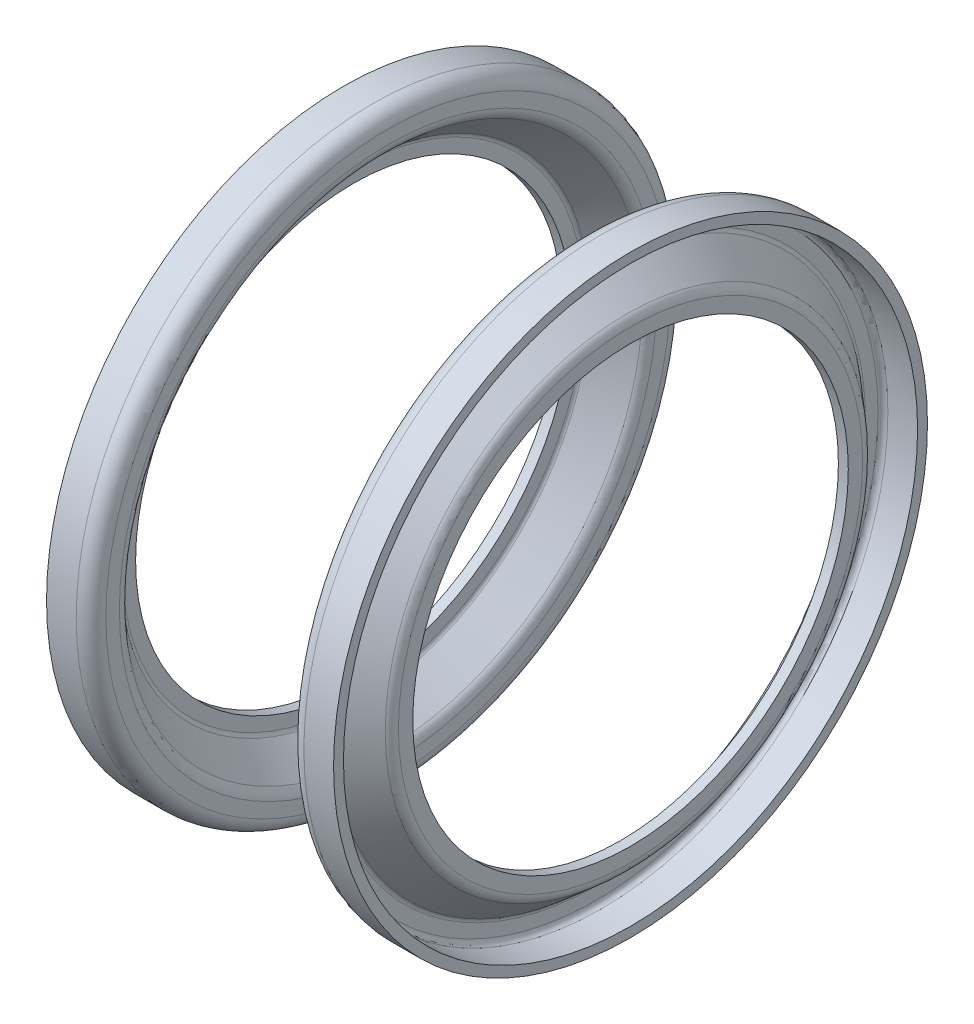
ISO-10303-21;
HEADER;
FILE_DESCRIPTION(('STEP AP214'),'2;1');
FILE_NAME('part.step','',(''),(''),'','','');
FILE_SCHEMA(('AUTOMOTIVE_DESIGN { 1 0 10303 214 1 1 1 1 }'));
ENDSEC;
DATA;
#1=APPLICATION_CONTEXT('core data for automotive mechanical design processes');
#2=APPLICATION_PROTOCOL_DEFINITION('international standard','automotive_design',2000,#1);
#3=PRODUCT_CONTEXT('',#1,'mechanical');
#4=PRODUCT('Part','Part','',(#3));
#5=PRODUCT_RELATED_PRODUCT_CATEGORY('part','',(#4));
#6=PRODUCT_DEFINITION_FORMATION('','',#4);
#7=PRODUCT_DEFINITION_CONTEXT('part definition',#1,'design');
#8=PRODUCT_DEFINITION('design','',#6,#7);
#9=PRODUCT_DEFINITION_SHAPE('','',#8);
#10=(LENGTH_UNIT() NAMED_UNIT(*) SI_UNIT(.MILLI.,.METRE.));
#11=(NAMED_UNIT(*) PLANE_ANGLE_UNIT() SI_UNIT($,.RADIAN.));
#12=(NAMED_UNIT(*) SI_UNIT($,.STERADIAN.) SOLID_ANGLE_UNIT());
#13=UNCERTAINTY_MEASURE_WITH_UNIT(LENGTH_MEASURE(1.E-05),#10,'distance_accuracy_value','');
#14=(GEOMETRIC_REPRESENTATION_CONTEXT(3) GLOBAL_UNCERTAINTY_ASSIGNED_CONTEXT((#13)) GLOBAL_UNIT_ASSIGNED_CONTEXT((#10,
#11,#12)) REPRESENTATION_CONTEXT('',''));
#15=CARTESIAN_POINT('',(0.,0.,0.));
#16=DIRECTION('',(0.,0.,1.));
#17=DIRECTION('',(1.,0.,0.));
#18=AXIS2_PLACEMENT_3D('',#15,#16,#17);
#19=CARTESIAN_POINT('',(-0.45,-3.01,-3.01));
#20=DIRECTION('',(-1.,0.,0.));
#21=DIRECTION('',(0.,0.,1.));
#22=AXIS2_PLACEMENT_3D('',#19,#20,#21);
#23=PLANE('',#22);
#24=CARTESIAN_POINT('',(-0.45,0.,0.));
#25=DIRECTION('',(-1.,0.,0.));
#26=DIRECTION('',(0.,0.,1.));
#27=AXIS2_PLACEMENT_3D('',#24,#25,#26);
#28=CIRCLE('',#27,2.9);
#29=CARTESIAN_POINT('',(-0.45,0.,2.9));
#30=VERTEX_POINT('',#29);
#31=CARTESIAN_POINT('',(-0.45,0.,-2.9));
#32=VERTEX_POINT('',#31);
#33=EDGE_CURVE('P0_E21',#30,#32,#28,.T.);
#34=ORIENTED_EDGE('',*,*,#33,.F.);
#35=CARTESIAN_POINT('',(-0.45,0.,0.));
#36=DIRECTION('',(-1.,0.,0.));
#37=DIRECTION('',(0.,0.,-1.));
#38=AXIS2_PLACEMENT_3D('',#35,#36,#37);
#39=CIRCLE('',#38,2.9);
#40=EDGE_CURVE('P0_E240',#32,#30,#39,.T.);
#41=ORIENTED_EDGE('',*,*,#40,.F.);
#42=EDGE_LOOP('',(#34,#41));
#43=FACE_BOUND('',#42,.T.);
#44=CARTESIAN_POINT('',(-0.45,0.,0.));
#45=DIRECTION('',(-1.,0.,0.));
#46=DIRECTION('',(0.,0.,1.));
#47=AXIS2_PLACEMENT_3D('',#44,#45,#46);
#48=CIRCLE('',#47,3.);
#49=CARTESIAN_POINT('',(-0.45,0.,3.));
#50=VERTEX_POINT('',#49);
#51=CARTESIAN_POINT('',(-0.45,0.,-3.));
#52=VERTEX_POINT('',#51);
#53=EDGE_CURVE('P0_E540',#50,#52,#48,.T.);
#54=ORIENTED_EDGE('',*,*,#53,.T.);
#55=CARTESIAN_POINT('',(-0.45,0.,0.));
#56=DIRECTION('',(-1.,0.,0.));
#57=DIRECTION('',(0.,0.,-1.));
#58=AXIS2_PLACEMENT_3D('',#55,#56,#57);
#59=CIRCLE('',#58,3.);
#60=EDGE_CURVE('P0_E27',#52,#50,#59,.T.);
#61=ORIENTED_EDGE('',*,*,#60,.T.);
#62=EDGE_LOOP('',(#54,#61));
#63=FACE_BOUND('',#62,.T.);
#64=ADVANCED_FACE('P0_F17',(#43,#63),#23,.T.);
#65=CARTESIAN_POINT('',(-0.45,0.,0.));
#66=DIRECTION('',(1.,0.,0.));
#67=DIRECTION('',(0.,0.,-1.));
#68=AXIS2_PLACEMENT_3D('',#65,#66,#67);
#69=CYLINDRICAL_SURFACE('',#68,3.);
#70=ORIENTED_EDGE('',*,*,#53,.F.);
#71=ORIENTED_EDGE('',*,*,#60,.F.);
#72=DIRECTION('',(1.,0.,0.));
#73=VECTOR('',#72,1.);
#74=CARTESIAN_POINT('',(-0.3,0.,-3.));
#75=LINE('',#74,#73);
#76=CARTESIAN_POINT('',(-0.15,0.,-3.));
#77=VERTEX_POINT('',#76);
#78=EDGE_CURVE('P0_E11',#52,#77,#75,.T.);
#79=ORIENTED_EDGE('',*,*,#78,.T.);
#80=CARTESIAN_POINT('',(-0.15,0.,0.));
#81=DIRECTION('',(-1.,0.,0.));
#82=DIRECTION('',(0.,0.,-1.));
#83=AXIS2_PLACEMENT_3D('',#80,#81,#82);
#84=CIRCLE('',#83,3.);
#85=CARTESIAN_POINT('',(-0.15,0.,3.));
#86=VERTEX_POINT('',#85);
#87=EDGE_CURVE('P0_E106',#77,#86,#84,.T.);
#88=ORIENTED_EDGE('',*,*,#87,.T.);
#89=CARTESIAN_POINT('',(-0.15,0.,0.));
#90=DIRECTION('',(-1.,0.,0.));
#91=DIRECTION('',(0.,0.,1.));
#92=AXIS2_PLACEMENT_3D('',#89,#90,#91);
#93=CIRCLE('',#92,3.);
#94=EDGE_CURVE('P0_E109',#86,#77,#93,.T.);
#95=ORIENTED_EDGE('',*,*,#94,.T.);
#96=ORIENTED_EDGE('',*,*,#78,.F.);
#97=EDGE_LOOP('',(#70,#71,#79,#88,#95,#96));
#98=FACE_BOUND('',#97,.T.);
#99=ADVANCED_FACE('P0_F108',(#98),#69,.T.);
#100=CARTESIAN_POINT('',(-0.150000000000003,0.,0.));
#101=DIRECTION('',(-1.,0.,0.));
#102=DIRECTION('',(0.,0.,1.));
#103=AXIS2_PLACEMENT_3D('',#100,#101,#102);
#104=TOROIDAL_SURFACE('',#103,2.85,0.150000000000001);
#105=ORIENTED_EDGE('',*,*,#94,.F.);
#106=ORIENTED_EDGE('',*,*,#87,.F.);
#107=CARTESIAN_POINT('',(-0.150000000000003,0.,-2.85));
#108=DIRECTION('',(0.,-1.,0.));
#109=DIRECTION('',(0.,0.,-1.));
#110=AXIS2_PLACEMENT_3D('',#107,#108,#109);
#111=CIRCLE('',#110,0.150000000000001);
#112=CARTESIAN_POINT('',(0.,0.,-2.85));
#113=VERTEX_POINT('',#112);
#114=EDGE_CURVE('P0_E113',#77,#113,#111,.T.);
#115=ORIENTED_EDGE('',*,*,#114,.T.);
#116=CARTESIAN_POINT('',(0.,0.,0.));
#117=DIRECTION('',(-1.,0.,0.));
#118=DIRECTION('',(0.,0.,-1.));
#119=AXIS2_PLACEMENT_3D('',#116,#117,#118);
#120=CIRCLE('',#119,2.85);
#121=CARTESIAN_POINT('',(0.,0.,2.85));
#122=VERTEX_POINT('',#121);
#123=EDGE_CURVE('P0_E118',#113,#122,#120,.T.);
#124=ORIENTED_EDGE('',*,*,#123,.T.);
#125=CARTESIAN_POINT('',(0.,0.,0.));
#126=DIRECTION('',(-1.,0.,0.));
#127=DIRECTION('',(0.,0.,1.));
#128=AXIS2_PLACEMENT_3D('',#125,#126,#127);
#129=CIRCLE('',#128,2.85);
#130=EDGE_CURVE('P0_E126',#122,#113,#129,.T.);
#131=ORIENTED_EDGE('',*,*,#130,.T.);
#132=ORIENTED_EDGE('',*,*,#114,.F.);
#133=EDGE_LOOP('',(#105,#106,#115,#124,#131,#132));
#134=FACE_BOUND('',#133,.T.);
#135=ADVANCED_FACE('P0_F115',(#134),#104,.T.);
#136=CARTESIAN_POINT('',(0.,-2.86,2.86));
#137=DIRECTION('',(1.,0.,0.));
#138=DIRECTION('',(0.,0.,-1.));
#139=AXIS2_PLACEMENT_3D('',#136,#137,#138);
#140=PLANE('',#139);
#141=CARTESIAN_POINT('',(0.,0.,0.));
#142=DIRECTION('',(-1.,0.,0.));
#143=DIRECTION('',(0.,0.,1.));
#144=AXIS2_PLACEMENT_3D('',#141,#142,#143);
#145=CIRCLE('',#144,2.71379804767391);
#146=CARTESIAN_POINT('',(0.,0.,2.71379804767391));
#147=VERTEX_POINT('',#146);
#148=CARTESIAN_POINT('',(0.,0.,-2.71379804767391));
#149=VERTEX_POINT('',#148);
#150=EDGE_CURVE('P0_E138',#147,#149,#145,.T.);
#151=ORIENTED_EDGE('',*,*,#150,.T.);
#152=CARTESIAN_POINT('',(0.,0.,0.));
#153=DIRECTION('',(-1.,0.,0.));
#154=DIRECTION('',(0.,0.,-1.));
#155=AXIS2_PLACEMENT_3D('',#152,#153,#154);
#156=CIRCLE('',#155,2.71379804767391);
#157=EDGE_CURVE('P0_E135',#149,#147,#156,.T.);
#158=ORIENTED_EDGE('',*,*,#157,.T.);
#159=EDGE_LOOP('',(#151,#158));
#160=FACE_BOUND('',#159,.T.);
#161=ORIENTED_EDGE('',*,*,#130,.F.);
#162=ORIENTED_EDGE('',*,*,#123,.F.);
#163=EDGE_LOOP('',(#161,#162));
#164=FACE_BOUND('',#163,.T.);
#165=ADVANCED_FACE('P0_F315',(#160,#164),#140,.T.);
#166=CARTESIAN_POINT('',(-0.129999999999563,0.,0.));
#167=DIRECTION('',(-1.,0.,0.));
#168=DIRECTION('',(0.,0.,1.));
#169=AXIS2_PLACEMENT_3D('',#166,#167,#168);
#170=TOROIDAL_SURFACE('',#169,2.71379804767391,0.129999999999562);
#171=ORIENTED_EDGE('',*,*,#150,.F.);
#172=ORIENTED_EDGE('',*,*,#157,.F.);
#173=CARTESIAN_POINT('',(-0.129999999999563,0.,-2.71379804767391));
#174=DIRECTION('',(0.,-1.,0.));
#175=DIRECTION('',(1.,0.,0.));
#176=AXIS2_PLACEMENT_3D('',#173,#174,#175);
#177=CIRCLE('',#176,0.129999999999562);
#178=CARTESIAN_POINT('',(-0.045397121450573,0.,-2.6150946893662));
#179=VERTEX_POINT('',#178);
#180=EDGE_CURVE('P0_E132',#149,#179,#177,.T.);
#181=ORIENTED_EDGE('',*,*,#180,.T.);
#182=CARTESIAN_POINT('',(-0.0453971214508456,0.,0.));
#183=DIRECTION('',(-1.,0.,0.));
#184=DIRECTION('',(0.,0.,-1.));
#185=AXIS2_PLACEMENT_3D('',#182,#183,#184);
#186=CIRCLE('',#185,2.61509468936652);
#187=CARTESIAN_POINT('',(-0.0453971214508456,0.,2.61509468936652));
#188=VERTEX_POINT('',#187);
#189=EDGE_CURVE('P0_E142',#179,#188,#186,.T.);
#190=ORIENTED_EDGE('',*,*,#189,.T.);
#191=CARTESIAN_POINT('',(-0.0453971214508456,0.,0.));
#192=DIRECTION('',(-1.,0.,0.));
#193=DIRECTION('',(0.,0.,1.));
#194=AXIS2_PLACEMENT_3D('',#191,#192,#193);
#195=CIRCLE('',#194,2.61509468936652);
#196=EDGE_CURVE('P0_E145',#188,#179,#195,.T.);
#197=ORIENTED_EDGE('',*,*,#196,.T.);
#198=ORIENTED_EDGE('',*,*,#180,.F.);
#199=EDGE_LOOP('',(#171,#172,#181,#190,#197,#198));
#200=FACE_BOUND('',#199,.T.);
#201=ADVANCED_FACE('P0_F318',(#200),#170,.T.);
#202=CARTESIAN_POINT('',(-0.045397121450573,0.,0.));
#203=DIRECTION('',(1.,0.,0.));
#204=DIRECTION('',(0.,0.,-1.));
#205=AXIS2_PLACEMENT_3D('',#202,#203,#204);
#206=CONICAL_SURFACE('',#205,2.6150946893662,0.708626272126568);
#207=CARTESIAN_POINT('',(-0.332539568672797,0.,0.));
#208=DIRECTION('',(-1.,0.,0.));
#209=DIRECTION('',(0.,0.,1.));
#210=AXIS2_PLACEMENT_3D('',#207,#208,#209);
#211=CIRCLE('',#210,2.3689725917477);
#212=CARTESIAN_POINT('',(-0.332539568672797,0.,2.3689725917477));
#213=VERTEX_POINT('',#212);
#214=CARTESIAN_POINT('',(-0.332539568672807,0.,-2.36897259174771));
#215=VERTEX_POINT('',#214);
#216=EDGE_CURVE('P0_E155',#213,#215,#211,.T.);
#217=ORIENTED_EDGE('',*,*,#216,.T.);
#218=DIRECTION('',(0.759256602366014,0.,-0.650791373455132));
#219=VECTOR('',#218,1.);
#220=CARTESIAN_POINT('',(-0.188968345061685,0.,-2.49203364055695));
#221=LINE('',#220,#219);
#222=EDGE_CURVE('P0_E149',#215,#179,#221,.T.);
#223=ORIENTED_EDGE('',*,*,#222,.T.);
#224=ORIENTED_EDGE('',*,*,#196,.F.);
#225=ORIENTED_EDGE('',*,*,#189,.F.);
#226=ORIENTED_EDGE('',*,*,#222,.F.);
#227=CARTESIAN_POINT('',(-0.332539568672797,0.,0.));
#228=DIRECTION('',(-1.,0.,0.));
#229=DIRECTION('',(0.,0.,-1.));
#230=AXIS2_PLACEMENT_3D('',#227,#228,#229);
#231=CIRCLE('',#230,2.3689725917477);
#232=EDGE_CURVE('P0_E153',#215,#213,#231,.T.);
#233=ORIENTED_EDGE('',*,*,#232,.T.);
#234=EDGE_LOOP('',(#217,#223,#224,#225,#226,#233));
#235=FACE_BOUND('',#234,.T.);
#236=ADVANCED_FACE('P0_F322',(#235),#206,.F.);
#237=CARTESIAN_POINT('',(-0.300000000000003,0.,0.));
#238=DIRECTION('',(-1.,0.,0.));
#239=DIRECTION('',(0.,0.,1.));
#240=AXIS2_PLACEMENT_3D('',#237,#238,#239);
#241=TOROIDAL_SURFACE('',#240,2.33100976162945,0.0499999999999984);
#242=CARTESIAN_POINT('',(-0.35,0.,0.));
#243=DIRECTION('',(-1.,0.,0.));
#244=DIRECTION('',(0.,0.,1.));
#245=AXIS2_PLACEMENT_3D('',#242,#243,#244);
#246=CIRCLE('',#245,2.33100976162943);
#247=CARTESIAN_POINT('',(-0.35,0.,2.33100976162943));
#248=VERTEX_POINT('',#247);
#249=CARTESIAN_POINT('',(-0.35,0.,-2.33100976162943));
#250=VERTEX_POINT('',#249);
#251=EDGE_CURVE('P0_E165',#248,#250,#246,.T.);
#252=ORIENTED_EDGE('',*,*,#251,.T.);
#253=CARTESIAN_POINT('',(-0.300000000000003,0.,-2.33100976162945));
#254=DIRECTION('',(0.,-1.,0.));
#255=DIRECTION('',(-1.,0.,3.90312782094806E-13));
#256=AXIS2_PLACEMENT_3D('',#253,#254,#255);
#257=CIRCLE('',#256,0.0499999999999984);
#258=EDGE_CURVE('P0_E158',#250,#215,#257,.T.);
#259=ORIENTED_EDGE('',*,*,#258,.T.);
#260=ORIENTED_EDGE('',*,*,#216,.F.);
#261=ORIENTED_EDGE('',*,*,#232,.F.);
#262=ORIENTED_EDGE('',*,*,#258,.F.);
#263=CARTESIAN_POINT('',(-0.35,0.,0.));
#264=DIRECTION('',(-1.,0.,0.));
#265=DIRECTION('',(0.,0.,-1.));
#266=AXIS2_PLACEMENT_3D('',#263,#264,#265);
#267=CIRCLE('',#266,2.33100976162943);
#268=EDGE_CURVE('P0_E162',#250,#248,#267,.T.);
#269=ORIENTED_EDGE('',*,*,#268,.T.);
#270=EDGE_LOOP('',(#252,#259,#260,#261,#262,#269));
#271=FACE_BOUND('',#270,.T.);
#272=ADVANCED_FACE('P0_F326',(#271),#241,.F.);
#273=CARTESIAN_POINT('',(-0.35,-2.34100976162943,2.34100976162943));
#274=DIRECTION('',(1.,0.,0.));
#275=DIRECTION('',(0.,0.,-1.));
#276=AXIS2_PLACEMENT_3D('',#273,#274,#275);
#277=PLANE('',#276);
#278=CARTESIAN_POINT('',(-0.35,0.,0.));
#279=DIRECTION('',(-1.,0.,0.));
#280=DIRECTION('',(0.,0.,1.));
#281=AXIS2_PLACEMENT_3D('',#278,#279,#280);
#282=CIRCLE('',#281,2.2);
#283=CARTESIAN_POINT('',(-0.35,0.,2.2));
#284=VERTEX_POINT('',#283);
#285=CARTESIAN_POINT('',(-0.35,0.,-2.2));
#286=VERTEX_POINT('',#285);
#287=EDGE_CURVE('P0_E172',#284,#286,#282,.T.);
#288=ORIENTED_EDGE('',*,*,#287,.T.);
#289=CARTESIAN_POINT('',(-0.35,0.,0.));
#290=DIRECTION('',(-1.,0.,0.));
#291=DIRECTION('',(0.,0.,-1.));
#292=AXIS2_PLACEMENT_3D('',#289,#290,#291);
#293=CIRCLE('',#292,2.2);
#294=EDGE_CURVE('P0_E169',#286,#284,#293,.T.);
#295=ORIENTED_EDGE('',*,*,#294,.T.);
#296=EDGE_LOOP('',(#288,#295));
#297=FACE_BOUND('',#296,.T.);
#298=ORIENTED_EDGE('',*,*,#251,.F.);
#299=ORIENTED_EDGE('',*,*,#268,.F.);
#300=EDGE_LOOP('',(#298,#299));
#301=FACE_BOUND('',#300,.T.);
#302=ADVANCED_FACE('P0_F330',(#297,#301),#277,.T.);
#303=CARTESIAN_POINT('',(-0.35,0.,0.));
#304=DIRECTION('',(-1.,0.,0.));
#305=DIRECTION('',(0.,0.,1.));
#306=AXIS2_PLACEMENT_3D('',#303,#304,#305);
#307=CYLINDRICAL_SURFACE('',#306,2.2);
#308=CARTESIAN_POINT('',(-0.45,0.,0.));
#309=DIRECTION('',(-1.,0.,0.));
#310=DIRECTION('',(0.,0.,1.));
#311=AXIS2_PLACEMENT_3D('',#308,#309,#310);
#312=CIRCLE('',#311,2.2);
#313=CARTESIAN_POINT('',(-0.45,0.,2.2));
#314=VERTEX_POINT('',#313);
#315=CARTESIAN_POINT('',(-0.45,0.,-2.2));
#316=VERTEX_POINT('',#315);
#317=EDGE_CURVE('P0_E183',#314,#316,#312,.T.);
#318=ORIENTED_EDGE('',*,*,#317,.T.);
#319=DIRECTION('',(1.,0.,0.));
#320=VECTOR('',#319,1.);
#321=CARTESIAN_POINT('',(-0.4,0.,-2.2));
#322=LINE('',#321,#320);
#323=EDGE_CURVE('P0_E176',#316,#286,#322,.T.);
#324=ORIENTED_EDGE('',*,*,#323,.T.);
#325=ORIENTED_EDGE('',*,*,#287,.F.);
#326=ORIENTED_EDGE('',*,*,#294,.F.);
#327=ORIENTED_EDGE('',*,*,#323,.F.);
#328=CARTESIAN_POINT('',(-0.45,0.,0.));
#329=DIRECTION('',(-1.,0.,0.));
#330=DIRECTION('',(0.,0.,-1.));
#331=AXIS2_PLACEMENT_3D('',#328,#329,#330);
#332=CIRCLE('',#331,2.2);
#333=EDGE_CURVE('P0_E180',#316,#314,#332,.T.);
#334=ORIENTED_EDGE('',*,*,#333,.T.);
#335=EDGE_LOOP('',(#318,#324,#325,#326,#327,#334));
#336=FACE_BOUND('',#335,.T.);
#337=ADVANCED_FACE('P0_F334',(#336),#307,.F.);
#338=CARTESIAN_POINT('',(-0.45,-2.35480780930355,-2.35480780930355));
#339=DIRECTION('',(-1.,0.,0.));
#340=DIRECTION('',(0.,0.,1.));
#341=AXIS2_PLACEMENT_3D('',#338,#339,#340);
#342=PLANE('',#341);
#343=ORIENTED_EDGE('',*,*,#317,.F.);
#344=ORIENTED_EDGE('',*,*,#333,.F.);
#345=EDGE_LOOP('',(#343,#344));
#346=FACE_BOUND('',#345,.T.);
#347=CARTESIAN_POINT('',(-0.45,0.,0.));
#348=DIRECTION('',(-1.,0.,0.));
#349=DIRECTION('',(0.,0.,1.));
#350=AXIS2_PLACEMENT_3D('',#347,#348,#349);
#351=CIRCLE('',#350,2.34480780930355);
#352=CARTESIAN_POINT('',(-0.45,0.,2.34480780930355));
#353=VERTEX_POINT('',#352);
#354=CARTESIAN_POINT('',(-0.45,0.,-2.34480780930355));
#355=VERTEX_POINT('',#354);
#356=EDGE_CURVE('P0_E194',#353,#355,#351,.T.);
#357=ORIENTED_EDGE('',*,*,#356,.T.);
#358=CARTESIAN_POINT('',(-0.45,0.,0.));
#359=DIRECTION('',(-1.,0.,0.));
#360=DIRECTION('',(0.,0.,-1.));
#361=AXIS2_PLACEMENT_3D('',#358,#359,#360);
#362=CIRCLE('',#361,2.34480780930355);
#363=EDGE_CURVE('P0_E190',#355,#353,#362,.T.);
#364=ORIENTED_EDGE('',*,*,#363,.T.);
#365=EDGE_LOOP('',(#357,#364));
#366=FACE_BOUND('',#365,.T.);
#367=ADVANCED_FACE('P0_F338',(#346,#366),#342,.T.);
#368=CARTESIAN_POINT('',(-0.329999999999996,0.,0.));
#369=DIRECTION('',(-1.,0.,0.));
#370=DIRECTION('',(0.,0.,1.));
#371=AXIS2_PLACEMENT_3D('',#368,#369,#370);
#372=TOROIDAL_SURFACE('',#371,2.34480780930357,0.120000000000003);
#373=ORIENTED_EDGE('',*,*,#356,.F.);
#374=ORIENTED_EDGE('',*,*,#363,.F.);
#375=CARTESIAN_POINT('',(-0.329999999999996,0.,-2.34480780930358));
#376=DIRECTION('',(0.,-1.,0.));
#377=DIRECTION('',(-1.,0.,2.16840434497094E-13));
#378=AXIS2_PLACEMENT_3D('',#375,#376,#377);
#379=CIRCLE('',#378,0.120000000000003);
#380=CARTESIAN_POINT('',(-0.408094964814718,0.,-2.43591860158738));
#381=VERTEX_POINT('',#380);
#382=EDGE_CURVE('P0_E187',#355,#381,#379,.T.);
#383=ORIENTED_EDGE('',*,*,#382,.T.);
#384=CARTESIAN_POINT('',(-0.40809496481473,0.,0.));
#385=DIRECTION('',(-1.,0.,0.));
#386=DIRECTION('',(0.,0.,-1.));
#387=AXIS2_PLACEMENT_3D('',#384,#385,#386);
#388=CIRCLE('',#387,2.4359186015874);
#389=CARTESIAN_POINT('',(-0.40809496481473,0.,2.4359186015874));
#390=VERTEX_POINT('',#389);
#391=EDGE_CURVE('P0_E201',#381,#390,#388,.T.);
#392=ORIENTED_EDGE('',*,*,#391,.T.);
#393=CARTESIAN_POINT('',(-0.40809496481473,0.,0.));
#394=DIRECTION('',(-1.,0.,0.));
#395=DIRECTION('',(0.,0.,1.));
#396=AXIS2_PLACEMENT_3D('',#393,#394,#395);
#397=CIRCLE('',#396,2.4359186015874);
#398=EDGE_CURVE('P0_E204',#390,#381,#397,.T.);
#399=ORIENTED_EDGE('',*,*,#398,.T.);
#400=ORIENTED_EDGE('',*,*,#382,.F.);
#401=EDGE_LOOP('',(#373,#374,#383,#392,#399,#400));
#402=FACE_BOUND('',#401,.T.);
#403=ADVANCED_FACE('P0_F342',(#402),#372,.T.);
#404=CARTESIAN_POINT('',(-0.408094964814718,0.,0.));
#405=DIRECTION('',(1.,0.,0.));
#406=DIRECTION('',(0.,0.,-1.));
#407=AXIS2_PLACEMENT_3D('',#404,#405,#406);
#408=CONICAL_SURFACE('',#407,2.43591860158738,0.708626272127681);
#409=ORIENTED_EDGE('',*,*,#398,.F.);
#410=ORIENTED_EDGE('',*,*,#391,.F.);
#411=DIRECTION('',(0.759256602365289,0.,-0.650791373455977));
#412=VECTOR('',#411,1.);
#413=CARTESIAN_POINT('',(-0.262777698070689,0.,-2.56047625879655));
#414=LINE('',#413,#412);
#415=CARTESIAN_POINT('',(-0.117460431325448,0.,-2.6850339160043));
#416=VERTEX_POINT('',#415);
#417=EDGE_CURVE('P0_E198',#381,#416,#414,.T.);
#418=ORIENTED_EDGE('',*,*,#417,.T.);
#419=CARTESIAN_POINT('',(-0.117460431325448,0.,0.));
#420=DIRECTION('',(-1.,0.,0.));
#421=DIRECTION('',(0.,0.,-1.));
#422=AXIS2_PLACEMENT_3D('',#419,#420,#421);
#423=CIRCLE('',#422,2.6850339160043);
#424=CARTESIAN_POINT('',(-0.117460431325448,0.,2.6850339160043));
#425=VERTEX_POINT('',#424);
#426=EDGE_CURVE('P0_E208',#416,#425,#423,.T.);
#427=ORIENTED_EDGE('',*,*,#426,.T.);
#428=CARTESIAN_POINT('',(-0.117460431325448,0.,0.));
#429=DIRECTION('',(-1.,0.,0.));
#430=DIRECTION('',(0.,0.,1.));
#431=AXIS2_PLACEMENT_3D('',#428,#429,#430);
#432=CIRCLE('',#431,2.6850339160043);
#433=EDGE_CURVE('P0_E212',#425,#416,#432,.T.);
#434=ORIENTED_EDGE('',*,*,#433,.T.);
#435=ORIENTED_EDGE('',*,*,#417,.F.);
#436=EDGE_LOOP('',(#409,#410,#418,#427,#434,#435));
#437=FACE_BOUND('',#436,.T.);
#438=ADVANCED_FACE('P0_F285',(#437),#408,.T.);
#439=CARTESIAN_POINT('',(-0.150000000002818,0.,0.));
#440=DIRECTION('',(-1.,0.,0.));
#441=DIRECTION('',(0.,0.,1.));
#442=AXIS2_PLACEMENT_3D('',#439,#440,#441);
#443=TOROIDAL_SURFACE('',#442,2.72299674612235,0.0500000000028179);
#444=CARTESIAN_POINT('',(-0.1,0.,0.));
#445=DIRECTION('',(-1.,0.,0.));
#446=DIRECTION('',(0.,0.,1.));
#447=AXIS2_PLACEMENT_3D('',#444,#445,#446);
#448=CIRCLE('',#447,2.72299674612891);
#449=CARTESIAN_POINT('',(-0.1,0.,2.72299674612891));
#450=VERTEX_POINT('',#449);
#451=CARTESIAN_POINT('',(-0.1,0.,-2.72299674612891));
#452=VERTEX_POINT('',#451);
#453=EDGE_CURVE('P0_E224',#450,#452,#448,.T.);
#454=ORIENTED_EDGE('',*,*,#453,.T.);
#455=CARTESIAN_POINT('',(-0.150000000002818,0.,-2.72299674612236));
#456=DIRECTION('',(0.,-1.,0.));
#457=DIRECTION('',(1.,0.,-1.31058358602661E-10));
#458=AXIS2_PLACEMENT_3D('',#455,#456,#457);
#459=CIRCLE('',#458,0.0500000000028179);
#460=EDGE_CURVE('P0_E216',#452,#416,#459,.T.);
#461=ORIENTED_EDGE('',*,*,#460,.T.);
#462=ORIENTED_EDGE('',*,*,#433,.F.);
#463=ORIENTED_EDGE('',*,*,#426,.F.);
#464=ORIENTED_EDGE('',*,*,#460,.F.);
#465=CARTESIAN_POINT('',(-0.1,0.,0.));
#466=DIRECTION('',(-1.,0.,0.));
#467=DIRECTION('',(0.,0.,-1.));
#468=AXIS2_PLACEMENT_3D('',#465,#466,#467);
#469=CIRCLE('',#468,2.72299674612891);
#470=EDGE_CURVE('P0_E220',#452,#450,#469,.T.);
#471=ORIENTED_EDGE('',*,*,#470,.T.);
#472=EDGE_LOOP('',(#454,#461,#462,#463,#464,#471));
#473=FACE_BOUND('',#472,.T.);
#474=ADVANCED_FACE('P0_F289',(#473),#443,.F.);
#475=CARTESIAN_POINT('',(-0.1,-2.86,-2.86));
#476=DIRECTION('',(-1.,0.,0.));
#477=DIRECTION('',(0.,0.,1.));
#478=AXIS2_PLACEMENT_3D('',#475,#476,#477);
#479=PLANE('',#478);
#480=ORIENTED_EDGE('',*,*,#453,.F.);
#481=ORIENTED_EDGE('',*,*,#470,.F.);
#482=EDGE_LOOP('',(#480,#481));
#483=FACE_BOUND('',#482,.T.);
#484=CARTESIAN_POINT('',(-0.1,0.,0.));
#485=DIRECTION('',(-1.,0.,0.));
#486=DIRECTION('',(0.,0.,1.));
#487=AXIS2_PLACEMENT_3D('',#484,#485,#486);
#488=CIRCLE('',#487,2.85);
#489=CARTESIAN_POINT('',(-0.1,0.,2.85));
#490=VERTEX_POINT('',#489);
#491=CARTESIAN_POINT('',(-0.1,0.,-2.85));
#492=VERTEX_POINT('',#491);
#493=EDGE_CURVE('P0_E232',#490,#492,#488,.T.);
#494=ORIENTED_EDGE('',*,*,#493,.T.);
#495=CARTESIAN_POINT('',(-0.1,0.,0.));
#496=DIRECTION('',(-1.,0.,0.));
#497=DIRECTION('',(0.,0.,-1.));
#498=AXIS2_PLACEMENT_3D('',#495,#496,#497);
#499=CIRCLE('',#498,2.85);
#500=EDGE_CURVE('P0_E228',#492,#490,#499,.T.);
#501=ORIENTED_EDGE('',*,*,#500,.T.);
#502=EDGE_LOOP('',(#494,#501));
#503=FACE_BOUND('',#502,.T.);
#504=ADVANCED_FACE('P0_F293',(#483,#503),#479,.T.);
#505=CARTESIAN_POINT('',(-0.150000000000003,0.,0.));
#506=DIRECTION('',(-1.,0.,0.));
#507=DIRECTION('',(0.,0.,1.));
#508=AXIS2_PLACEMENT_3D('',#505,#506,#507);
#509=TOROIDAL_SURFACE('',#508,2.85,0.0500000000000007);
#510=CARTESIAN_POINT('',(-0.15,0.,0.));
#511=DIRECTION('',(-1.,0.,0.));
#512=DIRECTION('',(0.,0.,1.));
#513=AXIS2_PLACEMENT_3D('',#510,#511,#512);
#514=CIRCLE('',#513,2.9);
#515=CARTESIAN_POINT('',(-0.15,0.,2.9));
#516=VERTEX_POINT('',#515);
#517=CARTESIAN_POINT('',(-0.15,0.,-2.9));
#518=VERTEX_POINT('',#517);
#519=EDGE_CURVE('P0_E248',#516,#518,#514,.T.);
#520=ORIENTED_EDGE('',*,*,#519,.T.);
#521=CARTESIAN_POINT('',(-0.150000000000003,0.,-2.85));
#522=DIRECTION('',(0.,-1.,0.));
#523=DIRECTION('',(0.,0.,-1.));
#524=AXIS2_PLACEMENT_3D('',#521,#522,#523);
#525=CIRCLE('',#524,0.0500000000000007);
#526=EDGE_CURVE('P0_E236',#518,#492,#525,.T.);
#527=ORIENTED_EDGE('',*,*,#526,.T.);
#528=ORIENTED_EDGE('',*,*,#493,.F.);
#529=ORIENTED_EDGE('',*,*,#500,.F.);
#530=ORIENTED_EDGE('',*,*,#526,.F.);
#531=CARTESIAN_POINT('',(-0.15,0.,0.));
#532=DIRECTION('',(-1.,0.,0.));
#533=DIRECTION('',(0.,0.,-1.));
#534=AXIS2_PLACEMENT_3D('',#531,#532,#533);
#535=CIRCLE('',#534,2.9);
#536=EDGE_CURVE('P0_E244',#518,#516,#535,.T.);
#537=ORIENTED_EDGE('',*,*,#536,.T.);
#538=EDGE_LOOP('',(#520,#527,#528,#529,#530,#537));
#539=FACE_BOUND('',#538,.T.);
#540=ADVANCED_FACE('P0_F296',(#539),#509,.F.);
#541=CARTESIAN_POINT('',(-0.15,0.,0.));
#542=DIRECTION('',(-1.,0.,0.));
#543=DIRECTION('',(0.,0.,1.));
#544=AXIS2_PLACEMENT_3D('',#541,#542,#543);
#545=CYLINDRICAL_SURFACE('',#544,2.9);
#546=ORIENTED_EDGE('',*,*,#33,.T.);
#547=DIRECTION('',(1.,0.,0.));
#548=VECTOR('',#547,1.);
#549=CARTESIAN_POINT('',(-0.3,0.,-2.9));
#550=LINE('',#549,#548);
#551=EDGE_CURVE('P0_E251',#32,#518,#550,.T.);
#552=ORIENTED_EDGE('',*,*,#551,.T.);
#553=ORIENTED_EDGE('',*,*,#519,.F.);
#554=ORIENTED_EDGE('',*,*,#536,.F.);
#555=ORIENTED_EDGE('',*,*,#551,.F.);
#556=ORIENTED_EDGE('',*,*,#40,.T.);
#557=EDGE_LOOP('',(#546,#552,#553,#554,#555,#556));
#558=FACE_BOUND('',#557,.T.);
#559=ADVANCED_FACE('P0_F19',(#558),#545,.F.);
#560=CLOSED_SHELL('',(#64,#99,#135,#165,#201,#236,#272,#302,#337,#367,#403,#438,#474,#504,#540,#559));
#561=MANIFOLD_SOLID_BREP('P0_B1',#560);
#562=CARTESIAN_POINT('',(2.12999999999957,0.,0.));
#563=DIRECTION('',(-1.,0.,0.));
#564=DIRECTION('',(0.,0.,1.));
#565=AXIS2_PLACEMENT_3D('',#562,#563,#564);
#566=TOROIDAL_SURFACE('',#565,2.7137980476739,0.129999999999572);
#567=CARTESIAN_POINT('',(2.04539712145057,0.,0.));
#568=DIRECTION('',(-1.,0.,0.));
#569=DIRECTION('',(0.,0.,1.));
#570=AXIS2_PLACEMENT_3D('',#567,#568,#569);
#571=CIRCLE('',#570,2.61509468936675);
#572=CARTESIAN_POINT('',(2.04539712145057,0.,2.61509468936675));
#573=VERTEX_POINT('',#572);
#574=CARTESIAN_POINT('',(2.04539712145057,0.,-2.61509468936675));
#575=VERTEX_POINT('',#574);
#576=EDGE_CURVE('P1_E21',#573,#575,#571,.T.);
#577=ORIENTED_EDGE('',*,*,#576,.F.);
#578=CARTESIAN_POINT('',(2.04539712145057,0.,0.));
#579=DIRECTION('',(-1.,0.,0.));
#580=DIRECTION('',(0.,0.,-1.));
#581=AXIS2_PLACEMENT_3D('',#578,#579,#580);
#582=CIRCLE('',#581,2.61509468936675);
#583=EDGE_CURVE('P1_E129',#575,#573,#582,.T.);
#584=ORIENTED_EDGE('',*,*,#583,.F.);
#585=CARTESIAN_POINT('',(2.12999999999957,0.,-2.71379804767391));
#586=DIRECTION('',(0.,-1.,0.));
#587=DIRECTION('',(-0.650791373456018,0.,0.759256602365254));
#588=AXIS2_PLACEMENT_3D('',#585,#586,#587);
#589=CIRCLE('',#588,0.129999999999572);
#590=CARTESIAN_POINT('',(2.,0.,-2.71379804767391));
#591=VERTEX_POINT('',#590);
#592=EDGE_CURVE('P1_E11',#575,#591,#589,.T.);
#593=ORIENTED_EDGE('',*,*,#592,.T.);
#594=CARTESIAN_POINT('',(2.,0.,0.));
#595=DIRECTION('',(-1.,0.,0.));
#596=DIRECTION('',(0.,0.,-1.));
#597=AXIS2_PLACEMENT_3D('',#594,#595,#596);
#598=CIRCLE('',#597,2.71379804767391);
#599=CARTESIAN_POINT('',(2.,0.,2.71379804767391));
#600=VERTEX_POINT('',#599);
#601=EDGE_CURVE('P1_E27',#591,#600,#598,.T.);
#602=ORIENTED_EDGE('',*,*,#601,.T.);
#603=CARTESIAN_POINT('',(2.,0.,0.));
#604=DIRECTION('',(-1.,0.,0.));
#605=DIRECTION('',(0.,0.,1.));
#606=AXIS2_PLACEMENT_3D('',#603,#604,#605);
#607=CIRCLE('',#606,2.71379804767391);
#608=EDGE_CURVE('P1_E275',#600,#591,#607,.T.);
#609=ORIENTED_EDGE('',*,*,#608,.T.);
#610=ORIENTED_EDGE('',*,*,#592,.F.);
#611=EDGE_LOOP('',(#577,#584,#593,#602,#609,#610));
#612=FACE_BOUND('',#611,.T.);
#613=ADVANCED_FACE('P1_F17',(#612),#566,.T.);
#614=CARTESIAN_POINT('',(2.,-2.86,-2.86));
#615=DIRECTION('',(-1.,0.,0.));
#616=DIRECTION('',(0.,0.,1.));
#617=AXIS2_PLACEMENT_3D('',#614,#615,#616);
#618=PLANE('',#617);
#619=ORIENTED_EDGE('',*,*,#608,.F.);
#620=ORIENTED_EDGE('',*,*,#601,.F.);
#621=EDGE_LOOP('',(#619,#620));
#622=FACE_BOUND('',#621,.T.);
#623=CARTESIAN_POINT('',(2.,0.,0.));
#624=DIRECTION('',(-1.,0.,0.));
#625=DIRECTION('',(0.,0.,1.));
#626=AXIS2_PLACEMENT_3D('',#623,#624,#625);
#627=CIRCLE('',#626,2.85);
#628=CARTESIAN_POINT('',(2.,0.,2.85));
#629=VERTEX_POINT('',#628);
#630=CARTESIAN_POINT('',(2.,0.,-2.85));
#631=VERTEX_POINT('',#630);
#632=EDGE_CURVE('P1_E265',#629,#631,#627,.T.);
#633=ORIENTED_EDGE('',*,*,#632,.T.);
#634=CARTESIAN_POINT('',(2.,0.,0.));
#635=DIRECTION('',(-1.,0.,0.));
#636=DIRECTION('',(0.,0.,-1.));
#637=AXIS2_PLACEMENT_3D('',#634,#635,#636);
#638=CIRCLE('',#637,2.85);
#639=EDGE_CURVE('P1_E269',#631,#629,#638,.T.);
#640=ORIENTED_EDGE('',*,*,#639,.T.);
#641=EDGE_LOOP('',(#633,#640));
#642=FACE_BOUND('',#641,.T.);
#643=ADVANCED_FACE('P1_F436',(#622,#642),#618,.T.);
#644=CARTESIAN_POINT('',(2.15,0.,0.));
#645=DIRECTION('',(-1.,0.,0.));
#646=DIRECTION('',(0.,0.,1.));
#647=AXIS2_PLACEMENT_3D('',#644,#645,#646);
#648=TOROIDAL_SURFACE('',#647,2.85,0.150000000000001);
#649=ORIENTED_EDGE('',*,*,#632,.F.);
#650=ORIENTED_EDGE('',*,*,#639,.F.);
#651=CARTESIAN_POINT('',(2.15,0.,-2.85));
#652=DIRECTION('',(0.,-1.,0.));
#653=DIRECTION('',(-1.,0.,0.));
#654=AXIS2_PLACEMENT_3D('',#651,#652,#653);
#655=CIRCLE('',#654,0.150000000000001);
#656=CARTESIAN_POINT('',(2.15,0.,-3.));
#657=VERTEX_POINT('',#656);
#658=EDGE_CURVE('P1_E272',#631,#657,#655,.T.);
#659=ORIENTED_EDGE('',*,*,#658,.T.);
#660=CARTESIAN_POINT('',(2.15,0.,0.));
#661=DIRECTION('',(-1.,0.,0.));
#662=DIRECTION('',(0.,0.,-1.));
#663=AXIS2_PLACEMENT_3D('',#660,#661,#662);
#664=CIRCLE('',#663,3.);
#665=CARTESIAN_POINT('',(2.15,0.,3.));
#666=VERTEX_POINT('',#665);
#667=EDGE_CURVE('P1_E259',#657,#666,#664,.T.);
#668=ORIENTED_EDGE('',*,*,#667,.T.);
#669=CARTESIAN_POINT('',(2.15,0.,0.));
#670=DIRECTION('',(-1.,0.,0.));
#671=DIRECTION('',(0.,0.,1.));
#672=AXIS2_PLACEMENT_3D('',#669,#670,#671);
#673=CIRCLE('',#672,3.);
#674=EDGE_CURVE('P1_E255',#666,#657,#673,.T.);
#675=ORIENTED_EDGE('',*,*,#674,.T.);
#676=ORIENTED_EDGE('',*,*,#658,.F.);
#677=EDGE_LOOP('',(#649,#650,#659,#668,#675,#676));
#678=FACE_BOUND('',#677,.T.);
#679=ADVANCED_FACE('P1_F447',(#678),#648,.T.);
#680=CARTESIAN_POINT('',(2.15,0.,0.));
#681=DIRECTION('',(1.,0.,0.));
#682=DIRECTION('',(0.,0.,-1.));
#683=AXIS2_PLACEMENT_3D('',#680,#681,#682);
#684=CYLINDRICAL_SURFACE('',#683,3.);
#685=ORIENTED_EDGE('',*,*,#674,.F.);
#686=ORIENTED_EDGE('',*,*,#667,.F.);
#687=DIRECTION('',(1.,0.,0.));
#688=VECTOR('',#687,1.);
#689=CARTESIAN_POINT('',(2.3,0.,-3.));
#690=LINE('',#689,#688);
#691=CARTESIAN_POINT('',(2.45,0.,-3.));
#692=VERTEX_POINT('',#691);
#693=EDGE_CURVE('P1_E262',#657,#692,#690,.T.);
#694=ORIENTED_EDGE('',*,*,#693,.T.);
#695=CARTESIAN_POINT('',(2.45,0.,0.));
#696=DIRECTION('',(-1.,0.,0.));
#697=DIRECTION('',(0.,0.,-1.));
#698=AXIS2_PLACEMENT_3D('',#695,#696,#697);
#699=CIRCLE('',#698,3.);
#700=CARTESIAN_POINT('',(2.45,0.,3.));
#701=VERTEX_POINT('',#700);
#702=EDGE_CURVE('P1_E252',#692,#701,#699,.T.);
#703=ORIENTED_EDGE('',*,*,#702,.T.);
#704=CARTESIAN_POINT('',(2.45,0.,0.));
#705=DIRECTION('',(-1.,0.,0.));
#706=DIRECTION('',(0.,0.,1.));
#707=AXIS2_PLACEMENT_3D('',#704,#705,#706);
#708=CIRCLE('',#707,3.);
#709=EDGE_CURVE('P1_E248',#701,#692,#708,.T.);
#710=ORIENTED_EDGE('',*,*,#709,.T.);
#711=ORIENTED_EDGE('',*,*,#693,.F.);
#712=EDGE_LOOP('',(#685,#686,#694,#703,#710,#711));
#713=FACE_BOUND('',#712,.T.);
#714=ADVANCED_FACE('P1_F402',(#713),#684,.T.);
#715=CARTESIAN_POINT('',(2.45,-3.01,3.01));
#716=DIRECTION('',(1.,0.,0.));
#717=DIRECTION('',(0.,0.,-1.));
#718=AXIS2_PLACEMENT_3D('',#715,#716,#717);
#719=PLANE('',#718);
#720=CARTESIAN_POINT('',(2.45,0.,0.));
#721=DIRECTION('',(-1.,0.,0.));
#722=DIRECTION('',(0.,0.,1.));
#723=AXIS2_PLACEMENT_3D('',#720,#721,#722);
#724=CIRCLE('',#723,2.9);
#725=CARTESIAN_POINT('',(2.45,0.,2.9));
#726=VERTEX_POINT('',#725);
#727=CARTESIAN_POINT('',(2.45,0.,-2.9));
#728=VERTEX_POINT('',#727);
#729=EDGE_CURVE('P1_E241',#726,#728,#724,.T.);
#730=ORIENTED_EDGE('',*,*,#729,.T.);
#731=CARTESIAN_POINT('',(2.45,0.,0.));
#732=DIRECTION('',(-1.,0.,0.));
#733=DIRECTION('',(0.,0.,-1.));
#734=AXIS2_PLACEMENT_3D('',#731,#732,#733);
#735=CIRCLE('',#734,2.9);
#736=EDGE_CURVE('P1_E245',#728,#726,#735,.T.);
#737=ORIENTED_EDGE('',*,*,#736,.T.);
#738=EDGE_LOOP('',(#730,#737));
#739=FACE_BOUND('',#738,.T.);
#740=ORIENTED_EDGE('',*,*,#709,.F.);
#741=ORIENTED_EDGE('',*,*,#702,.F.);
#742=EDGE_LOOP('',(#740,#741));
#743=FACE_BOUND('',#742,.T.);
#744=ADVANCED_FACE('P1_F397',(#739,#743),#719,.T.);
#745=CARTESIAN_POINT('',(2.45,0.,0.));
#746=DIRECTION('',(-1.,0.,0.));
#747=DIRECTION('',(0.,0.,1.));
#748=AXIS2_PLACEMENT_3D('',#745,#746,#747);
#749=CYLINDRICAL_SURFACE('',#748,2.9);
#750=CARTESIAN_POINT('',(2.15,0.,0.));
#751=DIRECTION('',(-1.,0.,0.));
#752=DIRECTION('',(0.,0.,1.));
#753=AXIS2_PLACEMENT_3D('',#750,#751,#752);
#754=CIRCLE('',#753,2.9);
#755=CARTESIAN_POINT('',(2.15,0.,2.9));
#756=VERTEX_POINT('',#755);
#757=CARTESIAN_POINT('',(2.15,0.,-2.9));
#758=VERTEX_POINT('',#757);
#759=EDGE_CURVE('P1_E230',#756,#758,#754,.T.);
#760=ORIENTED_EDGE('',*,*,#759,.T.);
#761=DIRECTION('',(1.,0.,0.));
#762=VECTOR('',#761,1.);
#763=CARTESIAN_POINT('',(2.3,0.,-2.9));
#764=LINE('',#763,#762);
#765=EDGE_CURVE('P1_E237',#758,#728,#764,.T.);
#766=ORIENTED_EDGE('',*,*,#765,.T.);
#767=ORIENTED_EDGE('',*,*,#729,.F.);
#768=ORIENTED_EDGE('',*,*,#736,.F.);
#769=ORIENTED_EDGE('',*,*,#765,.F.);
#770=CARTESIAN_POINT('',(2.15,0.,0.));
#771=DIRECTION('',(-1.,0.,0.));
#772=DIRECTION('',(0.,0.,-1.));
#773=AXIS2_PLACEMENT_3D('',#770,#771,#772);
#774=CIRCLE('',#773,2.9);
#775=EDGE_CURVE('P1_E234',#758,#756,#774,.T.);
#776=ORIENTED_EDGE('',*,*,#775,.T.);
#777=EDGE_LOOP('',(#760,#766,#767,#768,#769,#776));
#778=FACE_BOUND('',#777,.T.);
#779=ADVANCED_FACE('P1_F401',(#778),#749,.F.);
#780=CARTESIAN_POINT('',(2.15,0.,0.));
#781=DIRECTION('',(-1.,0.,0.));
#782=DIRECTION('',(0.,0.,1.));
#783=AXIS2_PLACEMENT_3D('',#780,#781,#782);
#784=TOROIDAL_SURFACE('',#783,2.85,0.0500000000000011);
#785=CARTESIAN_POINT('',(2.1,0.,0.));
#786=DIRECTION('',(-1.,0.,0.));
#787=DIRECTION('',(0.,0.,1.));
#788=AXIS2_PLACEMENT_3D('',#785,#786,#787);
#789=CIRCLE('',#788,2.85);
#790=CARTESIAN_POINT('',(2.1,0.,2.85));
#791=VERTEX_POINT('',#790);
#792=CARTESIAN_POINT('',(2.1,0.,-2.85));
#793=VERTEX_POINT('',#792);
#794=EDGE_CURVE('P1_E219',#791,#793,#789,.T.);
#795=ORIENTED_EDGE('',*,*,#794,.T.);
#796=CARTESIAN_POINT('',(2.15,0.,-2.85));
#797=DIRECTION('',(0.,-1.,0.));
#798=DIRECTION('',(-1.,0.,0.));
#799=AXIS2_PLACEMENT_3D('',#796,#797,#798);
#800=CIRCLE('',#799,0.0500000000000011);
#801=EDGE_CURVE('P1_E226',#793,#758,#800,.T.);
#802=ORIENTED_EDGE('',*,*,#801,.T.);
#803=ORIENTED_EDGE('',*,*,#759,.F.);
#804=ORIENTED_EDGE('',*,*,#775,.F.);
#805=ORIENTED_EDGE('',*,*,#801,.F.);
#806=CARTESIAN_POINT('',(2.1,0.,0.));
#807=DIRECTION('',(-1.,0.,0.));
#808=DIRECTION('',(0.,0.,-1.));
#809=AXIS2_PLACEMENT_3D('',#806,#807,#808);
#810=CIRCLE('',#809,2.85);
#811=EDGE_CURVE('P1_E223',#793,#791,#810,.T.);
#812=ORIENTED_EDGE('',*,*,#811,.T.);
#813=EDGE_LOOP('',(#795,#802,#803,#804,#805,#812));
#814=FACE_BOUND('',#813,.T.);
#815=ADVANCED_FACE('P1_F388',(#814),#784,.F.);
#816=CARTESIAN_POINT('',(2.1,-2.86,2.86));
#817=DIRECTION('',(1.,0.,0.));
#818=DIRECTION('',(0.,0.,-1.));
#819=AXIS2_PLACEMENT_3D('',#816,#817,#818);
#820=PLANE('',#819);
#821=CARTESIAN_POINT('',(2.0999999999983,0.,0.));
#822=DIRECTION('',(-1.,0.,0.));
#823=DIRECTION('',(0.,0.,1.));
#824=AXIS2_PLACEMENT_3D('',#821,#822,#823);
#825=CIRCLE('',#824,2.7229967461289);
#826=CARTESIAN_POINT('',(2.0999999999983,0.,2.7229967461289));
#827=VERTEX_POINT('',#826);
#828=CARTESIAN_POINT('',(2.0999999999983,0.,-2.7229967461289));
#829=VERTEX_POINT('',#828);
#830=EDGE_CURVE('P1_E212',#827,#829,#825,.T.);
#831=ORIENTED_EDGE('',*,*,#830,.T.);
#832=CARTESIAN_POINT('',(2.0999999999983,0.,0.));
#833=DIRECTION('',(-1.,0.,0.));
#834=DIRECTION('',(0.,0.,-1.));
#835=AXIS2_PLACEMENT_3D('',#832,#833,#834);
#836=CIRCLE('',#835,2.7229967461289);
#837=EDGE_CURVE('P1_E216',#829,#827,#836,.T.);
#838=ORIENTED_EDGE('',*,*,#837,.T.);
#839=EDGE_LOOP('',(#831,#838));
#840=FACE_BOUND('',#839,.T.);
#841=ORIENTED_EDGE('',*,*,#794,.F.);
#842=ORIENTED_EDGE('',*,*,#811,.F.);
#843=EDGE_LOOP('',(#841,#842));
#844=FACE_BOUND('',#843,.T.);
#845=ADVANCED_FACE('P1_F365',(#840,#844),#820,.T.);
#846=CARTESIAN_POINT('',(2.14999999999846,0.,0.));
#847=DIRECTION('',(-1.,0.,0.));
#848=DIRECTION('',(0.,0.,1.));
#849=AXIS2_PLACEMENT_3D('',#846,#847,#848);
#850=TOROIDAL_SURFACE('',#849,2.72299674612505,0.0500000000001621);
#851=CARTESIAN_POINT('',(2.11746043132667,0.,0.));
#852=DIRECTION('',(-1.,0.,0.));
#853=DIRECTION('',(0.,0.,1.));
#854=AXIS2_PLACEMENT_3D('',#851,#852,#853);
#855=CIRCLE('',#854,2.68503391600571);
#856=CARTESIAN_POINT('',(2.11746043132667,0.,2.68503391600571));
#857=VERTEX_POINT('',#856);
#858=CARTESIAN_POINT('',(2.11746043132667,0.,-2.68503391600571));
#859=VERTEX_POINT('',#858);
#860=EDGE_CURVE('P1_E198',#857,#859,#855,.T.);
#861=ORIENTED_EDGE('',*,*,#860,.T.);
#862=CARTESIAN_POINT('',(2.14999999999846,0.,-2.72299674612505));
#863=DIRECTION('',(0.,-1.,0.));
#864=DIRECTION('',(-0.650791373433797,0.,0.7592566023843));
#865=AXIS2_PLACEMENT_3D('',#862,#863,#864);
#866=CIRCLE('',#865,0.0500000000001621);
#867=EDGE_CURVE('P1_E208',#859,#829,#866,.T.);
#868=ORIENTED_EDGE('',*,*,#867,.T.);
#869=ORIENTED_EDGE('',*,*,#830,.F.);
#870=ORIENTED_EDGE('',*,*,#837,.F.);
#871=ORIENTED_EDGE('',*,*,#867,.F.);
#872=CARTESIAN_POINT('',(2.11746043132667,0.,0.));
#873=DIRECTION('',(-1.,0.,0.));
#874=DIRECTION('',(0.,0.,-1.));
#875=AXIS2_PLACEMENT_3D('',#872,#873,#874);
#876=CIRCLE('',#875,2.68503391600571);
#877=EDGE_CURVE('P1_E202',#859,#857,#876,.T.);
#878=ORIENTED_EDGE('',*,*,#877,.T.);
#879=EDGE_LOOP('',(#861,#868,#869,#870,#871,#878));
#880=FACE_BOUND('',#879,.T.);
#881=ADVANCED_FACE('P1_F361',(#880),#850,.F.);
#882=CARTESIAN_POINT('',(2.11746043132667,0.,0.));
#883=DIRECTION('',(-1.,0.,0.));
#884=DIRECTION('',(0.,0.,1.));
#885=AXIS2_PLACEMENT_3D('',#882,#883,#884);
#886=CONICAL_SURFACE('',#885,2.68503391600571,0.708626272127674);
#887=ORIENTED_EDGE('',*,*,#860,.F.);
#888=ORIENTED_EDGE('',*,*,#877,.F.);
#889=DIRECTION('',(0.759256602365294,0.,0.650791373455971));
#890=VECTOR('',#889,1.);
#891=CARTESIAN_POINT('',(2.26277769807069,0.,-2.56047625879655));
#892=LINE('',#891,#890);
#893=CARTESIAN_POINT('',(2.40809496481472,0.,-2.43591860158738));
#894=VERTEX_POINT('',#893);
#895=EDGE_CURVE('P1_E205',#859,#894,#892,.T.);
#896=ORIENTED_EDGE('',*,*,#895,.T.);
#897=CARTESIAN_POINT('',(2.40809496481472,0.,0.));
#898=DIRECTION('',(-1.,0.,0.));
#899=DIRECTION('',(0.,0.,-1.));
#900=AXIS2_PLACEMENT_3D('',#897,#898,#899);
#901=CIRCLE('',#900,2.43591860158738);
#902=CARTESIAN_POINT('',(2.40809496481472,0.,2.43591860158738));
#903=VERTEX_POINT('',#902);
#904=EDGE_CURVE('P1_E193',#894,#903,#901,.T.);
#905=ORIENTED_EDGE('',*,*,#904,.T.);
#906=CARTESIAN_POINT('',(2.40809496481472,0.,0.));
#907=DIRECTION('',(-1.,0.,0.));
#908=DIRECTION('',(0.,0.,1.));
#909=AXIS2_PLACEMENT_3D('',#906,#907,#908);
#910=CIRCLE('',#909,2.43591860158738);
#911=EDGE_CURVE('P1_E189',#903,#894,#910,.T.);
#912=ORIENTED_EDGE('',*,*,#911,.T.);
#913=ORIENTED_EDGE('',*,*,#895,.F.);
#914=EDGE_LOOP('',(#887,#888,#896,#905,#912,#913));
#915=FACE_BOUND('',#914,.T.);
#916=ADVANCED_FACE('P1_F341',(#915),#886,.T.);
#917=CARTESIAN_POINT('',(2.33000000000003,0.,0.));
#918=DIRECTION('',(-1.,0.,0.));
#919=DIRECTION('',(0.,0.,1.));
#920=AXIS2_PLACEMENT_3D('',#917,#918,#919);
#921=TOROIDAL_SURFACE('',#920,2.34480780930355,0.119999999999974);
#922=ORIENTED_EDGE('',*,*,#911,.F.);
#923=ORIENTED_EDGE('',*,*,#904,.F.);
#924=CARTESIAN_POINT('',(2.33000000000003,0.,-2.34480780930355));
#925=DIRECTION('',(0.,-1.,0.));
#926=DIRECTION('',(0.650791373455896,0.,-0.759256602365359));
#927=AXIS2_PLACEMENT_3D('',#924,#925,#926);
#928=CIRCLE('',#927,0.119999999999974);
#929=CARTESIAN_POINT('',(2.45,0.,-2.34480780930355));
#930=VERTEX_POINT('',#929);
#931=EDGE_CURVE('P1_E196',#894,#930,#928,.T.);
#932=ORIENTED_EDGE('',*,*,#931,.T.);
#933=CARTESIAN_POINT('',(2.45,0.,0.));
#934=DIRECTION('',(-1.,0.,0.));
#935=DIRECTION('',(0.,0.,-1.));
#936=AXIS2_PLACEMENT_3D('',#933,#934,#935);
#937=CIRCLE('',#936,2.34480780930355);
#938=CARTESIAN_POINT('',(2.45,0.,2.34480780930355));
#939=VERTEX_POINT('',#938);
#940=EDGE_CURVE('P1_E187',#930,#939,#937,.T.);
#941=ORIENTED_EDGE('',*,*,#940,.T.);
#942=CARTESIAN_POINT('',(2.45,0.,0.));
#943=DIRECTION('',(-1.,0.,0.));
#944=DIRECTION('',(0.,0.,1.));
#945=AXIS2_PLACEMENT_3D('',#942,#943,#944);
#946=CIRCLE('',#945,2.34480780930355);
#947=EDGE_CURVE('P1_E183',#939,#930,#946,.T.);
#948=ORIENTED_EDGE('',*,*,#947,.T.);
#949=ORIENTED_EDGE('',*,*,#931,.F.);
#950=EDGE_LOOP('',(#922,#923,#932,#941,#948,#949));
#951=FACE_BOUND('',#950,.T.);
#952=ADVANCED_FACE('P1_F337',(#951),#921,.T.);
#953=CARTESIAN_POINT('',(2.45,-2.35480780930355,2.35480780930355));
#954=DIRECTION('',(1.,0.,0.));
#955=DIRECTION('',(0.,0.,-1.));
#956=AXIS2_PLACEMENT_3D('',#953,#954,#955);
#957=PLANE('',#956);
#958=CARTESIAN_POINT('',(2.45,0.,0.));
#959=DIRECTION('',(-1.,0.,0.));
#960=DIRECTION('',(0.,0.,1.));
#961=AXIS2_PLACEMENT_3D('',#958,#959,#960);
#962=CIRCLE('',#961,2.2);
#963=CARTESIAN_POINT('',(2.45,0.,2.2));
#964=VERTEX_POINT('',#963);
#965=CARTESIAN_POINT('',(2.45,0.,-2.2));
#966=VERTEX_POINT('',#965);
#967=EDGE_CURVE('P1_E176',#964,#966,#962,.T.);
#968=ORIENTED_EDGE('',*,*,#967,.T.);
#969=CARTESIAN_POINT('',(2.45,0.,0.));
#970=DIRECTION('',(-1.,0.,0.));
#971=DIRECTION('',(0.,0.,-1.));
#972=AXIS2_PLACEMENT_3D('',#969,#970,#971);
#973=CIRCLE('',#972,2.2);
#974=EDGE_CURVE('P1_E180',#966,#964,#973,.T.);
#975=ORIENTED_EDGE('',*,*,#974,.T.);
#976=EDGE_LOOP('',(#968,#975));
#977=FACE_BOUND('',#976,.T.);
#978=ORIENTED_EDGE('',*,*,#947,.F.);
#979=ORIENTED_EDGE('',*,*,#940,.F.);
#980=EDGE_LOOP('',(#978,#979));
#981=FACE_BOUND('',#980,.T.);
#982=ADVANCED_FACE('P1_F328',(#977,#981),#957,.T.);
#983=CARTESIAN_POINT('',(2.45,0.,0.));
#984=DIRECTION('',(-1.,0.,0.));
#985=DIRECTION('',(0.,0.,1.));
#986=AXIS2_PLACEMENT_3D('',#983,#984,#985);
#987=CYLINDRICAL_SURFACE('',#986,2.2);
#988=CARTESIAN_POINT('',(2.35,0.,0.));
#989=DIRECTION('',(-1.,0.,0.));
#990=DIRECTION('',(0.,0.,1.));
#991=AXIS2_PLACEMENT_3D('',#988,#989,#990);
#992=CIRCLE('',#991,2.2);
#993=CARTESIAN_POINT('',(2.35,0.,2.2));
#994=VERTEX_POINT('',#993);
#995=CARTESIAN_POINT('',(2.35,0.,-2.2));
#996=VERTEX_POINT('',#995);
#997=EDGE_CURVE('P1_E165',#994,#996,#992,.T.);
#998=ORIENTED_EDGE('',*,*,#997,.T.);
#999=DIRECTION('',(1.,0.,0.));
#1000=VECTOR('',#999,1.);
#1001=CARTESIAN_POINT('',(2.4,0.,-2.2));
#1002=LINE('',#1001,#1000);
#1003=EDGE_CURVE('P1_E172',#996,#966,#1002,.T.);
#1004=ORIENTED_EDGE('',*,*,#1003,.T.);
#1005=ORIENTED_EDGE('',*,*,#967,.F.);
#1006=ORIENTED_EDGE('',*,*,#974,.F.);
#1007=ORIENTED_EDGE('',*,*,#1003,.F.);
#1008=CARTESIAN_POINT('',(2.35,0.,0.));
#1009=DIRECTION('',(-1.,0.,0.));
#1010=DIRECTION('',(0.,0.,-1.));
#1011=AXIS2_PLACEMENT_3D('',#1008,#1009,#1010);
#1012=CIRCLE('',#1011,2.2);
#1013=EDGE_CURVE('P1_E169',#996,#994,#1012,.T.);
#1014=ORIENTED_EDGE('',*,*,#1013,.T.);
#1015=EDGE_LOOP('',(#998,#1004,#1005,#1006,#1007,#1014));
#1016=FACE_BOUND('',#1015,.T.);
#1017=ADVANCED_FACE('P1_F316',(#1016),#987,.F.);
#1018=CARTESIAN_POINT('',(2.35,-2.34100976162943,-2.34100976162943));
#1019=DIRECTION('',(-1.,0.,0.));
#1020=DIRECTION('',(0.,0.,1.));
#1021=AXIS2_PLACEMENT_3D('',#1018,#1019,#1020);
#1022=PLANE('',#1021);
#1023=ORIENTED_EDGE('',*,*,#997,.F.);
#1024=ORIENTED_EDGE('',*,*,#1013,.F.);
#1025=EDGE_LOOP('',(#1023,#1024));
#1026=FACE_BOUND('',#1025,.T.);
#1027=CARTESIAN_POINT('',(2.35,0.,0.));
#1028=DIRECTION('',(-1.,0.,0.));
#1029=DIRECTION('',(0.,0.,1.));
#1030=AXIS2_PLACEMENT_3D('',#1027,#1028,#1029);
#1031=CIRCLE('',#1030,2.33100976162943);
#1032=CARTESIAN_POINT('',(2.35,0.,2.33100976162943));
#1033=VERTEX_POINT('',#1032);
#1034=CARTESIAN_POINT('',(2.35,0.,-2.33100976162943));
#1035=VERTEX_POINT('',#1034);
#1036=EDGE_CURVE('P1_E158',#1033,#1035,#1031,.T.);
#1037=ORIENTED_EDGE('',*,*,#1036,.T.);
#1038=CARTESIAN_POINT('',(2.35,0.,0.));
#1039=DIRECTION('',(-1.,0.,0.));
#1040=DIRECTION('',(0.,0.,-1.));
#1041=AXIS2_PLACEMENT_3D('',#1038,#1039,#1040);
#1042=CIRCLE('',#1041,2.33100976162943);
#1043=EDGE_CURVE('P1_E162',#1035,#1033,#1042,.T.);
#1044=ORIENTED_EDGE('',*,*,#1043,.T.);
#1045=EDGE_LOOP('',(#1037,#1044));
#1046=FACE_BOUND('',#1045,.T.);
#1047=ADVANCED_FACE('P1_F305',(#1026,#1046),#1022,.T.);
#1048=CARTESIAN_POINT('',(2.3,0.,0.));
#1049=DIRECTION('',(-1.,0.,0.));
#1050=DIRECTION('',(0.,0.,1.));
#1051=AXIS2_PLACEMENT_3D('',#1048,#1049,#1050);
#1052=TOROIDAL_SURFACE('',#1051,2.33100976162943,0.0500000000000014);
#1053=CARTESIAN_POINT('',(2.3325395686728,0.,0.));
#1054=DIRECTION('',(-1.,0.,0.));
#1055=DIRECTION('',(0.,0.,1.));
#1056=AXIS2_PLACEMENT_3D('',#1053,#1054,#1055);
#1057=CIRCLE('',#1056,2.3689725917477);
#1058=CARTESIAN_POINT('',(2.3325395686728,0.,2.3689725917477));
#1059=VERTEX_POINT('',#1058);
#1060=CARTESIAN_POINT('',(2.3325395686728,0.,-2.3689725917477));
#1061=VERTEX_POINT('',#1060);
#1062=EDGE_CURVE('P1_E144',#1059,#1061,#1057,.T.);
#1063=ORIENTED_EDGE('',*,*,#1062,.T.);
#1064=CARTESIAN_POINT('',(2.3,0.,-2.33100976162943));
#1065=DIRECTION('',(0.,-1.,0.));
#1066=DIRECTION('',(0.650791373455926,0.,-0.759256602365333));
#1067=AXIS2_PLACEMENT_3D('',#1064,#1065,#1066);
#1068=CIRCLE('',#1067,0.0500000000000014);
#1069=EDGE_CURVE('P1_E135',#1061,#1035,#1068,.T.);
#1070=ORIENTED_EDGE('',*,*,#1069,.T.);
#1071=ORIENTED_EDGE('',*,*,#1036,.F.);
#1072=ORIENTED_EDGE('',*,*,#1043,.F.);
#1073=ORIENTED_EDGE('',*,*,#1069,.F.);
#1074=CARTESIAN_POINT('',(2.3325395686728,0.,0.));
#1075=DIRECTION('',(-1.,0.,0.));
#1076=DIRECTION('',(0.,0.,-1.));
#1077=AXIS2_PLACEMENT_3D('',#1074,#1075,#1076);
#1078=CIRCLE('',#1077,2.3689725917477);
#1079=EDGE_CURVE('P1_E136',#1061,#1059,#1078,.T.);
#1080=ORIENTED_EDGE('',*,*,#1079,.T.);
#1081=EDGE_LOOP('',(#1063,#1070,#1071,#1072,#1073,#1080));
#1082=FACE_BOUND('',#1081,.T.);
#1083=ADVANCED_FACE('P1_F294',(#1082),#1052,.F.);
#1084=CARTESIAN_POINT('',(2.3325395686728,0.,0.));
#1085=DIRECTION('',(-1.,0.,0.));
#1086=DIRECTION('',(0.,0.,1.));
#1087=AXIS2_PLACEMENT_3D('',#1084,#1085,#1086);
#1088=CONICAL_SURFACE('',#1087,2.3689725917477,0.70862627212766);
#1089=ORIENTED_EDGE('',*,*,#576,.T.);
#1090=DIRECTION('',(0.759256602365302,0.,0.650791373455962));
#1091=VECTOR('',#1090,1.);
#1092=CARTESIAN_POINT('',(2.18896834506169,0.,-2.49203364055722));
#1093=LINE('',#1092,#1091);
#1094=EDGE_CURVE('P1_E133',#575,#1061,#1093,.T.);
#1095=ORIENTED_EDGE('',*,*,#1094,.T.);
#1096=ORIENTED_EDGE('',*,*,#1062,.F.);
#1097=ORIENTED_EDGE('',*,*,#1079,.F.);
#1098=ORIENTED_EDGE('',*,*,#1094,.F.);
#1099=ORIENTED_EDGE('',*,*,#583,.T.);
#1100=EDGE_LOOP('',(#1089,#1095,#1096,#1097,#1098,#1099));
#1101=FACE_BOUND('',#1100,.T.);
#1102=ADVANCED_FACE('P1_F19',(#1101),#1088,.F.);
#1103=CLOSED_SHELL('',(#613,#643,#679,#714,#744,#779,#815,#845,#881,#916,#952,#982,#1017,#1047,
#1083,#1102));
#1104=MANIFOLD_SOLID_BREP('P1_B1',#1103);
#1105=ADVANCED_BREP_SHAPE_REPRESENTATION('',(#18,#561,#1104),#14);
#1106=SHAPE_DEFINITION_REPRESENTATION(#9,#1105);
ENDSEC;
END-ISO-10303-21;
